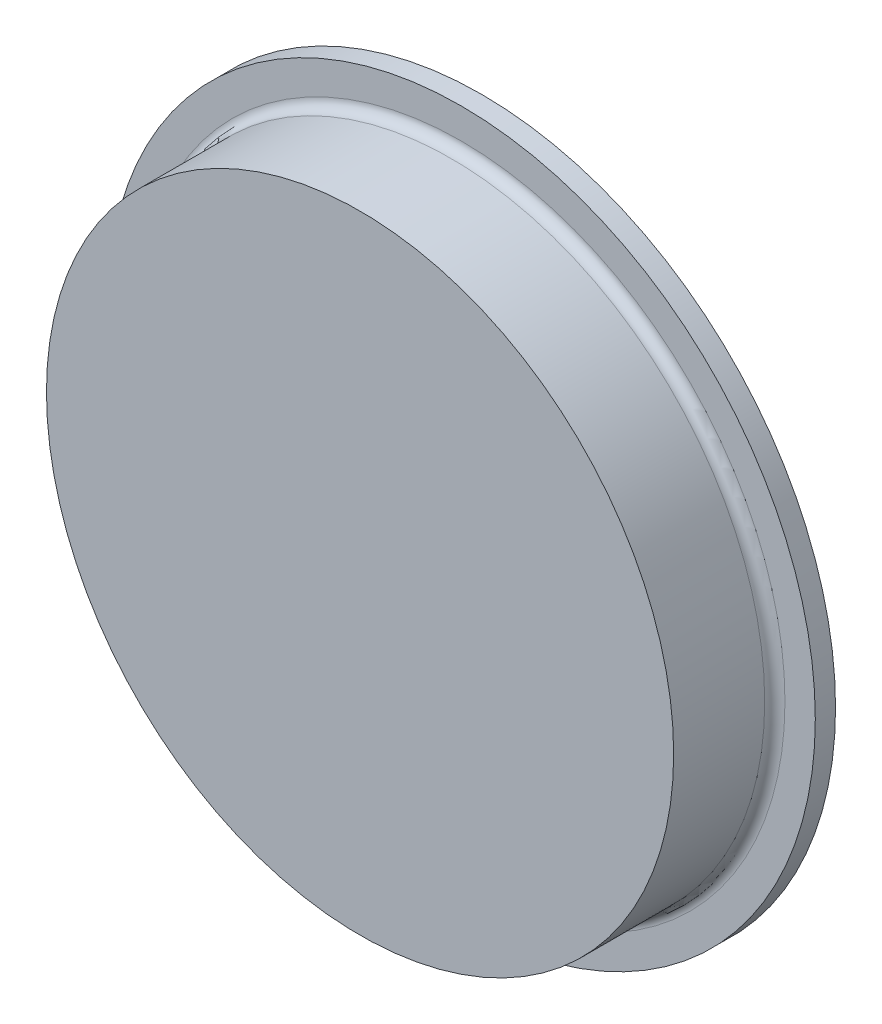
ISO-10303-21;
HEADER;
FILE_DESCRIPTION(('STEP AP214'),'2;1');
FILE_NAME('part.step','',(''),(''),'','','');
FILE_SCHEMA(('AUTOMOTIVE_DESIGN { 1 0 10303 214 1 1 1 1 }'));
ENDSEC;
DATA;
#1=APPLICATION_CONTEXT('core data for automotive mechanical design processes');
#2=APPLICATION_PROTOCOL_DEFINITION('international standard','automotive_design',2000,#1);
#3=PRODUCT_CONTEXT('',#1,'mechanical');
#4=PRODUCT('Part','Part','',(#3));
#5=PRODUCT_RELATED_PRODUCT_CATEGORY('part','',(#4));
#6=PRODUCT_DEFINITION_FORMATION('','',#4);
#7=PRODUCT_DEFINITION_CONTEXT('part definition',#1,'design');
#8=PRODUCT_DEFINITION('design','',#6,#7);
#9=PRODUCT_DEFINITION_SHAPE('','',#8);
#10=(LENGTH_UNIT() NAMED_UNIT(*) SI_UNIT(.MILLI.,.METRE.));
#11=(NAMED_UNIT(*) PLANE_ANGLE_UNIT() SI_UNIT($,.RADIAN.));
#12=(NAMED_UNIT(*) SI_UNIT($,.STERADIAN.) SOLID_ANGLE_UNIT());
#13=UNCERTAINTY_MEASURE_WITH_UNIT(LENGTH_MEASURE(1.E-05),#10,'distance_accuracy_value','');
#14=(GEOMETRIC_REPRESENTATION_CONTEXT(3) GLOBAL_UNCERTAINTY_ASSIGNED_CONTEXT((#13)) GLOBAL_UNIT_ASSIGNED_CONTEXT((#10,
#11,#12)) REPRESENTATION_CONTEXT('',''));
#15=CARTESIAN_POINT('',(0.,0.,0.));
#16=DIRECTION('',(0.,0.,1.));
#17=DIRECTION('',(1.,0.,0.));
#18=AXIS2_PLACEMENT_3D('',#15,#16,#17);
#19=CARTESIAN_POINT('',(0.,0.,5.));
#20=DIRECTION('',(0.,0.,-1.));
#21=DIRECTION('',(-1.,0.,0.));
#22=AXIS2_PLACEMENT_3D('',#19,#20,#21);
#23=CYLINDRICAL_SURFACE('',#22,31.);
#24=CARTESIAN_POINT('',(0.,0.,-4.));
#25=DIRECTION('',(0.,0.,-1.));
#26=DIRECTION('',(-1.,0.,0.));
#27=AXIS2_PLACEMENT_3D('',#24,#25,#26);
#28=CIRCLE('',#27,31.);
#29=CARTESIAN_POINT('',(-31.,0.,-4.));
#30=VERTEX_POINT('',#29);
#31=EDGE_CURVE('E52',#30,#30,#28,.F.);
#32=ORIENTED_EDGE('',*,*,#31,.T.);
#33=EDGE_LOOP('',(#32));
#34=FACE_BOUND('',#33,.T.);
#35=CARTESIAN_POINT('',(0.,0.,5.));
#36=DIRECTION('',(0.,0.,1.));
#37=DIRECTION('',(1.,0.,0.));
#38=AXIS2_PLACEMENT_3D('',#35,#36,#37);
#39=CIRCLE('',#38,31.);
#40=CARTESIAN_POINT('',(31.,0.,5.));
#41=VERTEX_POINT('',#40);
#42=EDGE_CURVE('E57',#41,#41,#39,.T.);
#43=ORIENTED_EDGE('',*,*,#42,.F.);
#44=EDGE_LOOP('',(#43));
#45=FACE_BOUND('',#44,.T.);
#46=ADVANCED_FACE('F37',(#34,#45),#23,.T.);
#47=CARTESIAN_POINT('',(0.,0.,5.));
#48=DIRECTION('',(0.,0.,1.));
#49=DIRECTION('',(1.,0.,0.));
#50=AXIS2_PLACEMENT_3D('',#47,#48,#49);
#51=PLANE('',#50);
#52=ORIENTED_EDGE('',*,*,#42,.T.);
#53=EDGE_LOOP('',(#52));
#54=FACE_BOUND('',#53,.T.);
#55=ADVANCED_FACE('F88',(#54),#51,.T.);
#56=CARTESIAN_POINT('',(0.,0.,-7.));
#57=DIRECTION('',(0.,0.,1.));
#58=DIRECTION('',(1.,0.,0.));
#59=AXIS2_PLACEMENT_3D('',#56,#57,#58);
#60=CYLINDRICAL_SURFACE('',#59,35.);
#61=CARTESIAN_POINT('',(0.,0.,-7.));
#62=DIRECTION('',(0.,0.,-1.));
#63=DIRECTION('',(-1.,0.,0.));
#64=AXIS2_PLACEMENT_3D('',#61,#62,#63);
#65=CIRCLE('',#64,35.);
#66=CARTESIAN_POINT('',(-35.,0.,-7.));
#67=VERTEX_POINT('',#66);
#68=EDGE_CURVE('E60',#67,#67,#65,.T.);
#69=ORIENTED_EDGE('',*,*,#68,.F.);
#70=EDGE_LOOP('',(#69));
#71=FACE_BOUND('',#70,.T.);
#72=CARTESIAN_POINT('',(0.,0.,-5.));
#73=DIRECTION('',(0.,0.,-1.));
#74=DIRECTION('',(-1.,0.,0.));
#75=AXIS2_PLACEMENT_3D('',#72,#73,#74);
#76=CIRCLE('',#75,35.);
#77=CARTESIAN_POINT('',(-35.,0.,-5.));
#78=VERTEX_POINT('',#77);
#79=EDGE_CURVE('E61',#78,#78,#76,.T.);
#80=ORIENTED_EDGE('',*,*,#79,.T.);
#81=EDGE_LOOP('',(#80));
#82=FACE_BOUND('',#81,.T.);
#83=ADVANCED_FACE('F95',(#71,#82),#60,.T.);
#84=CARTESIAN_POINT('',(0.,0.,-7.));
#85=DIRECTION('',(0.,0.,-1.));
#86=DIRECTION('',(-1.,0.,0.));
#87=AXIS2_PLACEMENT_3D('',#84,#85,#86);
#88=PLANE('',#87);
#89=CARTESIAN_POINT('',(0.,0.,-7.));
#90=DIRECTION('',(0.,0.,-1.));
#91=DIRECTION('',(-1.,0.,0.));
#92=AXIS2_PLACEMENT_3D('',#89,#90,#91);
#93=CIRCLE('',#92,6.);
#94=CARTESIAN_POINT('',(-6.,0.,-7.));
#95=VERTEX_POINT('',#94);
#96=EDGE_CURVE('E10',#95,#95,#93,.F.);
#97=ORIENTED_EDGE('',*,*,#96,.T.);
#98=EDGE_LOOP('',(#97));
#99=FACE_BOUND('',#98,.T.);
#100=ORIENTED_EDGE('',*,*,#68,.T.);
#101=EDGE_LOOP('',(#100));
#102=FACE_BOUND('',#101,.T.);
#103=ADVANCED_FACE('F83',(#99,#102),#88,.T.);
#104=CARTESIAN_POINT('',(0.,0.,-5.));
#105=DIRECTION('',(0.,0.,-1.));
#106=DIRECTION('',(-1.,0.,0.));
#107=AXIS2_PLACEMENT_3D('',#104,#105,#106);
#108=PLANE('',#107);
#109=CARTESIAN_POINT('',(0.,0.,-5.));
#110=DIRECTION('',(0.,0.,-1.));
#111=DIRECTION('',(-1.,0.,0.));
#112=AXIS2_PLACEMENT_3D('',#109,#110,#111);
#113=CIRCLE('',#112,32.);
#114=CARTESIAN_POINT('',(-32.,0.,-5.));
#115=VERTEX_POINT('',#114);
#116=EDGE_CURVE('E48',#115,#115,#113,.T.);
#117=ORIENTED_EDGE('',*,*,#116,.T.);
#118=EDGE_LOOP('',(#117));
#119=FACE_BOUND('',#118,.T.);
#120=ORIENTED_EDGE('',*,*,#79,.F.);
#121=EDGE_LOOP('',(#120));
#122=FACE_BOUND('',#121,.T.);
#123=ADVANCED_FACE('F74',(#119,#122),#108,.F.);
#124=CARTESIAN_POINT('',(0.,0.,-18.));
#125=DIRECTION('',(0.,0.,1.));
#126=DIRECTION('',(1.,0.,0.));
#127=AXIS2_PLACEMENT_3D('',#124,#125,#126);
#128=CYLINDRICAL_SURFACE('',#127,5.);
#129=CARTESIAN_POINT('',(0.,0.,-8.));
#130=DIRECTION('',(0.,0.,-1.));
#131=DIRECTION('',(-1.,0.,0.));
#132=AXIS2_PLACEMENT_3D('',#129,#130,#131);
#133=CIRCLE('',#132,5.);
#134=CARTESIAN_POINT('',(-5.,0.,-8.));
#135=VERTEX_POINT('',#134);
#136=EDGE_CURVE('E44',#135,#135,#133,.T.);
#137=ORIENTED_EDGE('',*,*,#136,.T.);
#138=EDGE_LOOP('',(#137));
#139=FACE_BOUND('',#138,.T.);
#140=CARTESIAN_POINT('',(0.,0.,-18.));
#141=DIRECTION('',(0.,0.,-1.));
#142=DIRECTION('',(-1.,0.,0.));
#143=AXIS2_PLACEMENT_3D('',#140,#141,#142);
#144=CIRCLE('',#143,5.);
#145=CARTESIAN_POINT('',(-5.,0.,-18.));
#146=VERTEX_POINT('',#145);
#147=EDGE_CURVE('E64',#146,#146,#144,.T.);
#148=ORIENTED_EDGE('',*,*,#147,.F.);
#149=EDGE_LOOP('',(#148));
#150=FACE_BOUND('',#149,.T.);
#151=ADVANCED_FACE('F72',(#139,#150),#128,.T.);
#152=CARTESIAN_POINT('',(0.,0.,-18.));
#153=DIRECTION('',(0.,0.,-1.));
#154=DIRECTION('',(-1.,0.,0.));
#155=AXIS2_PLACEMENT_3D('',#152,#153,#154);
#156=PLANE('',#155);
#157=ORIENTED_EDGE('',*,*,#147,.T.);
#158=EDGE_LOOP('',(#157));
#159=FACE_BOUND('',#158,.T.);
#160=ADVANCED_FACE('F70',(#159),#156,.T.);
#161=CARTESIAN_POINT('',(0.,0.,-4.));
#162=DIRECTION('',(0.,0.,-1.));
#163=DIRECTION('',(-1.,0.,0.));
#164=AXIS2_PLACEMENT_3D('',#161,#162,#163);
#165=TOROIDAL_SURFACE('',#164,32.,1.);
#166=ORIENTED_EDGE('',*,*,#116,.F.);
#167=EDGE_LOOP('',(#166));
#168=FACE_BOUND('',#167,.T.);
#169=ORIENTED_EDGE('',*,*,#31,.F.);
#170=EDGE_LOOP('',(#169));
#171=FACE_BOUND('',#170,.T.);
#172=ADVANCED_FACE('F81',(#168,#171),#165,.F.);
#173=CARTESIAN_POINT('',(0.,0.,-8.));
#174=DIRECTION('',(0.,0.,-1.));
#175=DIRECTION('',(-1.,0.,0.));
#176=AXIS2_PLACEMENT_3D('',#173,#174,#175);
#177=TOROIDAL_SURFACE('',#176,6.,1.);
#178=ORIENTED_EDGE('',*,*,#96,.F.);
#179=EDGE_LOOP('',(#178));
#180=FACE_BOUND('',#179,.T.);
#181=ORIENTED_EDGE('',*,*,#136,.F.);
#182=EDGE_LOOP('',(#181));
#183=FACE_BOUND('',#182,.T.);
#184=ADVANCED_FACE('F39',(#180,#183),#177,.F.);
#185=CLOSED_SHELL('',(#46,#55,#83,#103,#123,#151,#160,#172,#184));
#186=MANIFOLD_SOLID_BREP('B2',#185);
#187=ADVANCED_BREP_SHAPE_REPRESENTATION('',(#18,#186),#14);
#188=SHAPE_DEFINITION_REPRESENTATION(#9,#187);
ENDSEC;
END-ISO-10303-21;
